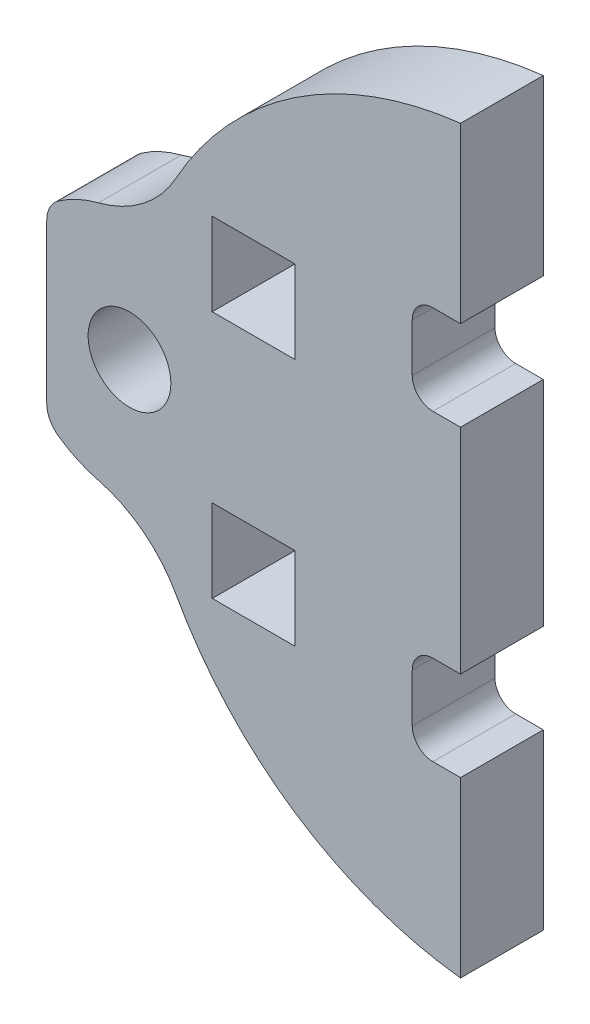
ISO-10303-21;
HEADER;
FILE_DESCRIPTION(('STEP AP214'),'2;1');
FILE_NAME('part.step','',(''),(''),'','','');
FILE_SCHEMA(('AUTOMOTIVE_DESIGN { 1 0 10303 214 1 1 1 1 }'));
ENDSEC;
DATA;
#1=APPLICATION_CONTEXT('core data for automotive mechanical design processes');
#2=APPLICATION_PROTOCOL_DEFINITION('international standard','automotive_design',2000,#1);
#3=PRODUCT_CONTEXT('',#1,'mechanical');
#4=PRODUCT('Part','Part','',(#3));
#5=PRODUCT_RELATED_PRODUCT_CATEGORY('part','',(#4));
#6=PRODUCT_DEFINITION_FORMATION('','',#4);
#7=PRODUCT_DEFINITION_CONTEXT('part definition',#1,'design');
#8=PRODUCT_DEFINITION('design','',#6,#7);
#9=PRODUCT_DEFINITION_SHAPE('','',#8);
#10=(LENGTH_UNIT() NAMED_UNIT(*) SI_UNIT(.MILLI.,.METRE.));
#11=(NAMED_UNIT(*) PLANE_ANGLE_UNIT() SI_UNIT($,.RADIAN.));
#12=(NAMED_UNIT(*) SI_UNIT($,.STERADIAN.) SOLID_ANGLE_UNIT());
#13=UNCERTAINTY_MEASURE_WITH_UNIT(LENGTH_MEASURE(1.E-05),#10,'distance_accuracy_value','');
#14=(GEOMETRIC_REPRESENTATION_CONTEXT(3) GLOBAL_UNCERTAINTY_ASSIGNED_CONTEXT((#13)) GLOBAL_UNIT_ASSIGNED_CONTEXT((#10,
#11,#12)) REPRESENTATION_CONTEXT('',''));
#15=CARTESIAN_POINT('',(0.,0.,0.));
#16=DIRECTION('',(0.,0.,1.));
#17=DIRECTION('',(1.,0.,0.));
#18=AXIS2_PLACEMENT_3D('',#15,#16,#17);
#19=CARTESIAN_POINT('',(14.6680433027,283.7018331993,3.));
#20=DIRECTION('',(0.,0.,1.));
#21=DIRECTION('',(1.,0.,0.));
#22=AXIS2_PLACEMENT_3D('',#19,#20,#21);
#23=PLANE('',#22);
#24=DIRECTION('',(1.,0.,0.));
#25=VECTOR('',#24,1.);
#26=CARTESIAN_POINT('',(17.6680433027,286.7018331993,3.));
#27=LINE('',#26,#25);
#28=CARTESIAN_POINT('',(17.6680433027,286.7018331993,3.));
#29=VERTEX_POINT('',#28);
#30=CARTESIAN_POINT('',(20.6680433027,286.7018331993,3.));
#31=VERTEX_POINT('',#30);
#32=EDGE_CURVE('E268',#29,#31,#27,.T.);
#33=ORIENTED_EDGE('',*,*,#32,.F.);
#34=DIRECTION('',(0.,-1.,0.));
#35=VECTOR('',#34,1.);
#36=CARTESIAN_POINT('',(17.6680433027,289.7018331993,3.));
#37=LINE('',#36,#35);
#38=CARTESIAN_POINT('',(17.6680433027,289.7018331993,3.));
#39=VERTEX_POINT('',#38);
#40=EDGE_CURVE('E266',#39,#29,#37,.T.);
#41=ORIENTED_EDGE('',*,*,#40,.F.);
#42=DIRECTION('',(-1.,0.,0.));
#43=VECTOR('',#42,1.);
#44=CARTESIAN_POINT('',(20.6680433027,289.7018331993,3.));
#45=LINE('',#44,#43);
#46=CARTESIAN_POINT('',(20.6680433027,289.7018331993,3.));
#47=VERTEX_POINT('',#46);
#48=EDGE_CURVE('E274',#47,#39,#45,.T.);
#49=ORIENTED_EDGE('',*,*,#48,.F.);
#50=DIRECTION('',(0.,1.,0.));
#51=VECTOR('',#50,1.);
#52=CARTESIAN_POINT('',(20.6680433027,286.7018331993,3.));
#53=LINE('',#52,#51);
#54=EDGE_CURVE('E271',#31,#47,#53,.T.);
#55=ORIENTED_EDGE('',*,*,#54,.F.);
#56=EDGE_LOOP('',(#33,#41,#49,#55));
#57=FACE_BOUND('',#56,.T.);
#58=CARTESIAN_POINT('',(14.6680433027,283.7018331993,3.));
#59=DIRECTION('',(0.,0.,1.));
#60=DIRECTION('',(1.,0.,0.));
#61=AXIS2_PLACEMENT_3D('',#58,#59,#60);
#62=CIRCLE('',#61,4.49999999999999);
#63=CARTESIAN_POINT('',(13.5430433027023,288.058939463784,3.));
#64=VERTEX_POINT('',#63);
#65=CARTESIAN_POINT('',(12.0966147312744,287.394766329219,3.));
#66=VERTEX_POINT('',#65);
#67=EDGE_CURVE('E303',#64,#66,#62,.T.);
#68=ORIENTED_EDGE('',*,*,#67,.T.);
#69=CARTESIAN_POINT('',(12.6680433027,286.574114522569,3.));
#70=DIRECTION('',(0.,0.,1.));
#71=DIRECTION('',(1.,0.,0.));
#72=AXIS2_PLACEMENT_3D('',#69,#70,#71);
#73=CIRCLE('',#72,0.999999999999989);
#74=CARTESIAN_POINT('',(11.6680433027,286.5741145225,3.));
#75=VERTEX_POINT('',#74);
#76=EDGE_CURVE('E306',#66,#75,#73,.T.);
#77=ORIENTED_EDGE('',*,*,#76,.T.);
#78=DIRECTION('',(0.,-1.,0.));
#79=VECTOR('',#78,1.);
#80=CARTESIAN_POINT('',(11.6680433027,286.5741145225,3.));
#81=LINE('',#80,#79);
#82=CARTESIAN_POINT('',(11.6680433027,280.829551876,3.));
#83=VERTEX_POINT('',#82);
#84=EDGE_CURVE('E309',#75,#83,#81,.T.);
#85=ORIENTED_EDGE('',*,*,#84,.T.);
#86=CARTESIAN_POINT('',(12.6680433027,280.829551876031,3.));
#87=DIRECTION('',(0.,0.,1.));
#88=DIRECTION('',(1.,0.,0.));
#89=AXIS2_PLACEMENT_3D('',#86,#87,#88);
#90=CIRCLE('',#89,0.999999999999995);
#91=CARTESIAN_POINT('',(12.0966147312744,280.008900069381,3.));
#92=VERTEX_POINT('',#91);
#93=EDGE_CURVE('E311',#83,#92,#90,.T.);
#94=ORIENTED_EDGE('',*,*,#93,.T.);
#95=CARTESIAN_POINT('',(14.6680433027,283.7018331993,3.));
#96=DIRECTION('',(0.,0.,1.));
#97=DIRECTION('',(1.,0.,0.));
#98=AXIS2_PLACEMENT_3D('',#95,#96,#97);
#99=CIRCLE('',#98,4.49999999999999);
#100=CARTESIAN_POINT('',(13.5430433027023,279.344726934816,3.));
#101=VERTEX_POINT('',#100);
#102=EDGE_CURVE('E313',#92,#101,#99,.T.);
#103=ORIENTED_EDGE('',*,*,#102,.T.);
#104=CARTESIAN_POINT('',(12.4180433027,274.987620670333,3.));
#105=DIRECTION('',(0.,0.,-1.));
#106=DIRECTION('',(1.,0.,0.));
#107=AXIS2_PLACEMENT_3D('',#104,#105,#106);
#108=CIRCLE('',#107,4.5);
#109=CARTESIAN_POINT('',(16.3555433027046,277.166173802567,3.));
#110=VERTEX_POINT('',#109);
#111=EDGE_CURVE('E315',#101,#110,#108,.T.);
#112=ORIENTED_EDGE('',*,*,#111,.T.);
#113=CARTESIAN_POINT('',(28.1680433027007,283.701833199299,3.));
#114=DIRECTION('',(0.,0.,1.));
#115=DIRECTION('',(1.,0.,0.));
#116=AXIS2_PLACEMENT_3D('',#113,#114,#115);
#117=CIRCLE('',#116,13.5);
#118=CARTESIAN_POINT('',(26.6680433027,270.2854253343,3.));
#119=VERTEX_POINT('',#118);
#120=EDGE_CURVE('E317',#110,#119,#117,.T.);
#121=ORIENTED_EDGE('',*,*,#120,.T.);
#122=DIRECTION('',(0.,1.,0.));
#123=VECTOR('',#122,1.);
#124=CARTESIAN_POINT('',(26.6680433027,276.5768331993,3.));
#125=LINE('',#124,#123);
#126=CARTESIAN_POINT('',(26.6680433027,276.5768331993,3.));
#127=VERTEX_POINT('',#126);
#128=EDGE_CURVE('E319',#119,#127,#125,.T.);
#129=ORIENTED_EDGE('',*,*,#128,.T.);
#130=DIRECTION('',(-1.,0.,0.));
#131=VECTOR('',#130,1.);
#132=CARTESIAN_POINT('',(25.6680433027,276.5768331993,3.));
#133=LINE('',#132,#131);
#134=CARTESIAN_POINT('',(25.6680433027,276.5768331993,3.));
#135=VERTEX_POINT('',#134);
#136=EDGE_CURVE('E321',#127,#135,#133,.T.);
#137=ORIENTED_EDGE('',*,*,#136,.T.);
#138=CARTESIAN_POINT('',(25.6680433027,277.3268331993,3.));
#139=DIRECTION('',(0.,0.,-1.));
#140=DIRECTION('',(1.,0.,0.));
#141=AXIS2_PLACEMENT_3D('',#138,#139,#140);
#142=CIRCLE('',#141,0.750000000000013);
#143=CARTESIAN_POINT('',(24.9180433027,277.3268331993,3.));
#144=VERTEX_POINT('',#143);
#145=EDGE_CURVE('E323',#135,#144,#142,.T.);
#146=ORIENTED_EDGE('',*,*,#145,.T.);
#147=DIRECTION('',(0.,1.,0.));
#148=VECTOR('',#147,1.);
#149=CARTESIAN_POINT('',(24.9180433027,279.0768331993,3.));
#150=LINE('',#149,#148);
#151=CARTESIAN_POINT('',(24.9180433027,279.0768331993,3.));
#152=VERTEX_POINT('',#151);
#153=EDGE_CURVE('E325',#144,#152,#150,.T.);
#154=ORIENTED_EDGE('',*,*,#153,.T.);
#155=CARTESIAN_POINT('',(25.6680433027,279.0768331993,3.));
#156=DIRECTION('',(0.,0.,-1.));
#157=DIRECTION('',(1.,0.,0.));
#158=AXIS2_PLACEMENT_3D('',#155,#156,#157);
#159=CIRCLE('',#158,0.749999999999985);
#160=CARTESIAN_POINT('',(25.6680433027,279.8268331993,3.));
#161=VERTEX_POINT('',#160);
#162=EDGE_CURVE('E327',#152,#161,#159,.T.);
#163=ORIENTED_EDGE('',*,*,#162,.T.);
#164=DIRECTION('',(1.,0.,0.));
#165=VECTOR('',#164,1.);
#166=CARTESIAN_POINT('',(26.6680433027,279.8268331993,3.));
#167=LINE('',#166,#165);
#168=CARTESIAN_POINT('',(26.6680433027,279.8268331993,3.));
#169=VERTEX_POINT('',#168);
#170=EDGE_CURVE('E329',#161,#169,#167,.T.);
#171=ORIENTED_EDGE('',*,*,#170,.T.);
#172=DIRECTION('',(0.,1.,0.));
#173=VECTOR('',#172,1.);
#174=CARTESIAN_POINT('',(26.6680433027,287.5768331993,3.));
#175=LINE('',#174,#173);
#176=CARTESIAN_POINT('',(26.6680433027,287.5768331993,3.));
#177=VERTEX_POINT('',#176);
#178=EDGE_CURVE('E331',#169,#177,#175,.T.);
#179=ORIENTED_EDGE('',*,*,#178,.T.);
#180=DIRECTION('',(-1.,0.,0.));
#181=VECTOR('',#180,1.);
#182=CARTESIAN_POINT('',(26.6680433027,287.5768331993,3.));
#183=LINE('',#182,#181);
#184=CARTESIAN_POINT('',(25.6680433027,287.5768331993,3.));
#185=VERTEX_POINT('',#184);
#186=EDGE_CURVE('E333',#177,#185,#183,.T.);
#187=ORIENTED_EDGE('',*,*,#186,.T.);
#188=CARTESIAN_POINT('',(25.6680433027,288.3268331993,3.));
#189=DIRECTION('',(0.,0.,-1.));
#190=DIRECTION('',(1.,0.,0.));
#191=AXIS2_PLACEMENT_3D('',#188,#189,#190);
#192=CIRCLE('',#191,0.749999999999985);
#193=CARTESIAN_POINT('',(24.9180433027,288.3268331993,3.));
#194=VERTEX_POINT('',#193);
#195=EDGE_CURVE('E335',#185,#194,#192,.T.);
#196=ORIENTED_EDGE('',*,*,#195,.T.);
#197=DIRECTION('',(0.,1.,0.));
#198=VECTOR('',#197,1.);
#199=CARTESIAN_POINT('',(24.9180433027,288.3268331993,3.));
#200=LINE('',#199,#198);
#201=CARTESIAN_POINT('',(24.9180433027,290.0768331993,3.));
#202=VERTEX_POINT('',#201);
#203=EDGE_CURVE('E337',#194,#202,#200,.T.);
#204=ORIENTED_EDGE('',*,*,#203,.T.);
#205=CARTESIAN_POINT('',(25.6680433027002,290.0768331993,3.));
#206=DIRECTION('',(0.,0.,-1.));
#207=DIRECTION('',(1.,0.,0.));
#208=AXIS2_PLACEMENT_3D('',#205,#206,#207);
#209=CIRCLE('',#208,0.750000000000193);
#210=CARTESIAN_POINT('',(25.6680433027,290.8268331993,3.));
#211=VERTEX_POINT('',#210);
#212=EDGE_CURVE('E339',#202,#211,#209,.T.);
#213=ORIENTED_EDGE('',*,*,#212,.T.);
#214=DIRECTION('',(1.,0.,0.));
#215=VECTOR('',#214,1.);
#216=CARTESIAN_POINT('',(25.6680433027,290.8268331993,3.));
#217=LINE('',#216,#215);
#218=CARTESIAN_POINT('',(26.6680433027,290.8268331993,3.));
#219=VERTEX_POINT('',#218);
#220=EDGE_CURVE('E341',#211,#219,#217,.T.);
#221=ORIENTED_EDGE('',*,*,#220,.T.);
#222=DIRECTION('',(0.,1.,0.));
#223=VECTOR('',#222,1.);
#224=CARTESIAN_POINT('',(26.6680433027,297.1182410643,3.));
#225=LINE('',#224,#223);
#226=CARTESIAN_POINT('',(26.6680433027,297.1182410643,3.));
#227=VERTEX_POINT('',#226);
#228=EDGE_CURVE('E343',#219,#227,#225,.T.);
#229=ORIENTED_EDGE('',*,*,#228,.T.);
#230=CARTESIAN_POINT('',(28.1680433027007,283.701833199299,3.));
#231=DIRECTION('',(0.,0.,1.));
#232=DIRECTION('',(1.,0.,0.));
#233=AXIS2_PLACEMENT_3D('',#230,#231,#232);
#234=CIRCLE('',#233,13.500000000002);
#235=CARTESIAN_POINT('',(16.355543302704,290.237492596034,3.));
#236=VERTEX_POINT('',#235);
#237=EDGE_CURVE('E345',#227,#236,#234,.T.);
#238=ORIENTED_EDGE('',*,*,#237,.T.);
#239=CARTESIAN_POINT('',(12.4180433027,292.416045728267,3.));
#240=DIRECTION('',(0.,0.,-1.));
#241=DIRECTION('',(1.,0.,0.));
#242=AXIS2_PLACEMENT_3D('',#239,#240,#241);
#243=CIRCLE('',#242,4.49999999999991);
#244=EDGE_CURVE('E347',#236,#64,#243,.T.);
#245=ORIENTED_EDGE('',*,*,#244,.T.);
#246=EDGE_LOOP('',(#68,#77,#85,#94,#103,#112,#121,#129,#137,#146,#154,#163,#171,#179,#187,#196,
#204,#213,#221,#229,#238,#245));
#247=FACE_BOUND('',#246,.T.);
#248=CARTESIAN_POINT('',(14.6680433027,283.7018331993,3.));
#249=DIRECTION('',(0.,0.,1.));
#250=DIRECTION('',(1.,0.,0.));
#251=AXIS2_PLACEMENT_3D('',#248,#249,#250);
#252=CIRCLE('',#251,1.5);
#253=CARTESIAN_POINT('',(16.1680433027,283.7018331993,3.));
#254=VERTEX_POINT('',#253);
#255=EDGE_CURVE('E297',#254,#254,#252,.T.);
#256=ORIENTED_EDGE('',*,*,#255,.F.);
#257=EDGE_LOOP('',(#256));
#258=FACE_BOUND('',#257,.T.);
#259=DIRECTION('',(1.,0.,0.));
#260=VECTOR('',#259,1.);
#261=CARTESIAN_POINT('',(17.6680433027,277.7018331993,3.));
#262=LINE('',#261,#260);
#263=CARTESIAN_POINT('',(17.6680433027,277.7018331993,3.));
#264=VERTEX_POINT('',#263);
#265=CARTESIAN_POINT('',(20.6680433027,277.7018331993,3.));
#266=VERTEX_POINT('',#265);
#267=EDGE_CURVE('E238',#264,#266,#262,.T.);
#268=ORIENTED_EDGE('',*,*,#267,.F.);
#269=DIRECTION('',(0.,-1.,0.));
#270=VECTOR('',#269,1.);
#271=CARTESIAN_POINT('',(17.6680433027,280.7018331993,3.));
#272=LINE('',#271,#270);
#273=CARTESIAN_POINT('',(17.6680433027,280.7018331993,3.));
#274=VERTEX_POINT('',#273);
#275=EDGE_CURVE('E230',#274,#264,#272,.T.);
#276=ORIENTED_EDGE('',*,*,#275,.F.);
#277=DIRECTION('',(-1.,0.,0.));
#278=VECTOR('',#277,1.);
#279=CARTESIAN_POINT('',(20.6680433027,280.7018331993,3.));
#280=LINE('',#279,#278);
#281=CARTESIAN_POINT('',(20.6680433027,280.7018331993,3.));
#282=VERTEX_POINT('',#281);
#283=EDGE_CURVE('E252',#282,#274,#280,.T.);
#284=ORIENTED_EDGE('',*,*,#283,.F.);
#285=DIRECTION('',(0.,1.,0.));
#286=VECTOR('',#285,1.);
#287=CARTESIAN_POINT('',(20.6680433027,277.7018331993,3.));
#288=LINE('',#287,#286);
#289=EDGE_CURVE('E250',#266,#282,#288,.T.);
#290=ORIENTED_EDGE('',*,*,#289,.F.);
#291=EDGE_LOOP('',(#268,#276,#284,#290));
#292=FACE_BOUND('',#291,.T.);
#293=ADVANCED_FACE('F33',(#57,#247,#258,#292),#23,.T.);
#294=CARTESIAN_POINT('',(14.6680433027,283.7018331993,0.));
#295=DIRECTION('',(0.,0.,1.));
#296=DIRECTION('',(1.,0.,0.));
#297=AXIS2_PLACEMENT_3D('',#294,#295,#296);
#298=PLANE('',#297);
#299=DIRECTION('',(0.,-1.,0.));
#300=VECTOR('',#299,1.);
#301=CARTESIAN_POINT('',(17.6680433027,289.7018331993,0.));
#302=LINE('',#301,#300);
#303=CARTESIAN_POINT('',(17.6680433027,289.7018331993,0.));
#304=VERTEX_POINT('',#303);
#305=CARTESIAN_POINT('',(17.6680433027,286.7018331993,0.));
#306=VERTEX_POINT('',#305);
#307=EDGE_CURVE('E246',#304,#306,#302,.T.);
#308=ORIENTED_EDGE('',*,*,#307,.T.);
#309=DIRECTION('',(1.,0.,0.));
#310=VECTOR('',#309,1.);
#311=CARTESIAN_POINT('',(17.6680433027,286.7018331993,0.));
#312=LINE('',#311,#310);
#313=CARTESIAN_POINT('',(20.6680433027,286.7018331993,0.));
#314=VERTEX_POINT('',#313);
#315=EDGE_CURVE('E279',#306,#314,#312,.T.);
#316=ORIENTED_EDGE('',*,*,#315,.T.);
#317=DIRECTION('',(0.,1.,0.));
#318=VECTOR('',#317,1.);
#319=CARTESIAN_POINT('',(20.6680433027,286.7018331993,0.));
#320=LINE('',#319,#318);
#321=CARTESIAN_POINT('',(20.6680433027,289.7018331993,0.));
#322=VERTEX_POINT('',#321);
#323=EDGE_CURVE('E282',#314,#322,#320,.T.);
#324=ORIENTED_EDGE('',*,*,#323,.T.);
#325=DIRECTION('',(-1.,0.,0.));
#326=VECTOR('',#325,1.);
#327=CARTESIAN_POINT('',(20.6680433027,289.7018331993,0.));
#328=LINE('',#327,#326);
#329=EDGE_CURVE('E269',#322,#304,#328,.T.);
#330=ORIENTED_EDGE('',*,*,#329,.T.);
#331=EDGE_LOOP('',(#308,#316,#324,#330));
#332=FACE_BOUND('',#331,.T.);
#333=CARTESIAN_POINT('',(14.6680433027,283.7018331993,0.));
#334=DIRECTION('',(0.,0.,1.));
#335=DIRECTION('',(1.,0.,0.));
#336=AXIS2_PLACEMENT_3D('',#333,#334,#335);
#337=CIRCLE('',#336,4.49999999999999);
#338=CARTESIAN_POINT('',(13.5430433027023,288.058939463784,0.));
#339=VERTEX_POINT('',#338);
#340=CARTESIAN_POINT('',(12.0966147312744,287.394766329219,0.));
#341=VERTEX_POINT('',#340);
#342=EDGE_CURVE('E300',#339,#341,#337,.T.);
#343=ORIENTED_EDGE('',*,*,#342,.F.);
#344=CARTESIAN_POINT('',(12.4180433027,292.416045728267,0.));
#345=DIRECTION('',(0.,0.,-1.));
#346=DIRECTION('',(1.,0.,0.));
#347=AXIS2_PLACEMENT_3D('',#344,#345,#346);
#348=CIRCLE('',#347,4.49999999999991);
#349=CARTESIAN_POINT('',(16.355543302704,290.237492596034,0.));
#350=VERTEX_POINT('',#349);
#351=EDGE_CURVE('E307',#350,#339,#348,.T.);
#352=ORIENTED_EDGE('',*,*,#351,.F.);
#353=CARTESIAN_POINT('',(28.1680433027007,283.701833199299,0.));
#354=DIRECTION('',(0.,0.,1.));
#355=DIRECTION('',(1.,0.,0.));
#356=AXIS2_PLACEMENT_3D('',#353,#354,#355);
#357=CIRCLE('',#356,13.500000000002);
#358=CARTESIAN_POINT('',(26.6680433027,297.1182410643,0.));
#359=VERTEX_POINT('',#358);
#360=EDGE_CURVE('E390',#359,#350,#357,.T.);
#361=ORIENTED_EDGE('',*,*,#360,.F.);
#362=DIRECTION('',(0.,1.,0.));
#363=VECTOR('',#362,1.);
#364=CARTESIAN_POINT('',(26.6680433027,297.1182410643,0.));
#365=LINE('',#364,#363);
#366=CARTESIAN_POINT('',(26.6680433027,290.8268331993,0.));
#367=VERTEX_POINT('',#366);
#368=EDGE_CURVE('E388',#367,#359,#365,.T.);
#369=ORIENTED_EDGE('',*,*,#368,.F.);
#370=DIRECTION('',(1.,0.,0.));
#371=VECTOR('',#370,1.);
#372=CARTESIAN_POINT('',(25.6680433027,290.8268331993,0.));
#373=LINE('',#372,#371);
#374=CARTESIAN_POINT('',(25.6680433027,290.8268331993,0.));
#375=VERTEX_POINT('',#374);
#376=EDGE_CURVE('E386',#375,#367,#373,.T.);
#377=ORIENTED_EDGE('',*,*,#376,.F.);
#378=CARTESIAN_POINT('',(25.6680433027002,290.0768331993,0.));
#379=DIRECTION('',(0.,0.,-1.));
#380=DIRECTION('',(1.,0.,0.));
#381=AXIS2_PLACEMENT_3D('',#378,#379,#380);
#382=CIRCLE('',#381,0.750000000000193);
#383=CARTESIAN_POINT('',(24.9180433027,290.0768331993,0.));
#384=VERTEX_POINT('',#383);
#385=EDGE_CURVE('E384',#384,#375,#382,.T.);
#386=ORIENTED_EDGE('',*,*,#385,.F.);
#387=DIRECTION('',(0.,1.,0.));
#388=VECTOR('',#387,1.);
#389=CARTESIAN_POINT('',(24.9180433027,288.3268331993,0.));
#390=LINE('',#389,#388);
#391=CARTESIAN_POINT('',(24.9180433027,288.3268331993,0.));
#392=VERTEX_POINT('',#391);
#393=EDGE_CURVE('E382',#392,#384,#390,.T.);
#394=ORIENTED_EDGE('',*,*,#393,.F.);
#395=CARTESIAN_POINT('',(25.6680433027,288.3268331993,0.));
#396=DIRECTION('',(0.,0.,-1.));
#397=DIRECTION('',(1.,0.,0.));
#398=AXIS2_PLACEMENT_3D('',#395,#396,#397);
#399=CIRCLE('',#398,0.749999999999985);
#400=CARTESIAN_POINT('',(25.6680433027,287.5768331993,0.));
#401=VERTEX_POINT('',#400);
#402=EDGE_CURVE('E380',#401,#392,#399,.T.);
#403=ORIENTED_EDGE('',*,*,#402,.F.);
#404=DIRECTION('',(-1.,0.,0.));
#405=VECTOR('',#404,1.);
#406=CARTESIAN_POINT('',(26.6680433027,287.5768331993,0.));
#407=LINE('',#406,#405);
#408=CARTESIAN_POINT('',(26.6680433027,287.5768331993,0.));
#409=VERTEX_POINT('',#408);
#410=EDGE_CURVE('E378',#409,#401,#407,.T.);
#411=ORIENTED_EDGE('',*,*,#410,.F.);
#412=DIRECTION('',(0.,1.,0.));
#413=VECTOR('',#412,1.);
#414=CARTESIAN_POINT('',(26.6680433027,287.5768331993,0.));
#415=LINE('',#414,#413);
#416=CARTESIAN_POINT('',(26.6680433027,279.8268331993,0.));
#417=VERTEX_POINT('',#416);
#418=EDGE_CURVE('E376',#417,#409,#415,.T.);
#419=ORIENTED_EDGE('',*,*,#418,.F.);
#420=DIRECTION('',(1.,0.,0.));
#421=VECTOR('',#420,1.);
#422=CARTESIAN_POINT('',(26.6680433027,279.8268331993,0.));
#423=LINE('',#422,#421);
#424=CARTESIAN_POINT('',(25.6680433027,279.8268331993,0.));
#425=VERTEX_POINT('',#424);
#426=EDGE_CURVE('E374',#425,#417,#423,.T.);
#427=ORIENTED_EDGE('',*,*,#426,.F.);
#428=CARTESIAN_POINT('',(25.6680433027,279.0768331993,0.));
#429=DIRECTION('',(0.,0.,-1.));
#430=DIRECTION('',(1.,0.,0.));
#431=AXIS2_PLACEMENT_3D('',#428,#429,#430);
#432=CIRCLE('',#431,0.749999999999985);
#433=CARTESIAN_POINT('',(24.9180433027,279.0768331993,0.));
#434=VERTEX_POINT('',#433);
#435=EDGE_CURVE('E372',#434,#425,#432,.T.);
#436=ORIENTED_EDGE('',*,*,#435,.F.);
#437=DIRECTION('',(0.,1.,0.));
#438=VECTOR('',#437,1.);
#439=CARTESIAN_POINT('',(24.9180433027,279.0768331993,0.));
#440=LINE('',#439,#438);
#441=CARTESIAN_POINT('',(24.9180433027,277.3268331993,0.));
#442=VERTEX_POINT('',#441);
#443=EDGE_CURVE('E370',#442,#434,#440,.T.);
#444=ORIENTED_EDGE('',*,*,#443,.F.);
#445=CARTESIAN_POINT('',(25.6680433027,277.3268331993,0.));
#446=DIRECTION('',(0.,0.,-1.));
#447=DIRECTION('',(1.,0.,0.));
#448=AXIS2_PLACEMENT_3D('',#445,#446,#447);
#449=CIRCLE('',#448,0.750000000000013);
#450=CARTESIAN_POINT('',(25.6680433027,276.5768331993,0.));
#451=VERTEX_POINT('',#450);
#452=EDGE_CURVE('E368',#451,#442,#449,.T.);
#453=ORIENTED_EDGE('',*,*,#452,.F.);
#454=DIRECTION('',(-1.,0.,0.));
#455=VECTOR('',#454,1.);
#456=CARTESIAN_POINT('',(25.6680433027,276.5768331993,0.));
#457=LINE('',#456,#455);
#458=CARTESIAN_POINT('',(26.6680433027,276.5768331993,0.));
#459=VERTEX_POINT('',#458);
#460=EDGE_CURVE('E366',#459,#451,#457,.T.);
#461=ORIENTED_EDGE('',*,*,#460,.F.);
#462=DIRECTION('',(0.,1.,0.));
#463=VECTOR('',#462,1.);
#464=CARTESIAN_POINT('',(26.6680433027,276.5768331993,0.));
#465=LINE('',#464,#463);
#466=CARTESIAN_POINT('',(26.6680433027,270.2854253343,0.));
#467=VERTEX_POINT('',#466);
#468=EDGE_CURVE('E364',#467,#459,#465,.T.);
#469=ORIENTED_EDGE('',*,*,#468,.F.);
#470=CARTESIAN_POINT('',(28.1680433027007,283.701833199299,0.));
#471=DIRECTION('',(0.,0.,1.));
#472=DIRECTION('',(1.,0.,0.));
#473=AXIS2_PLACEMENT_3D('',#470,#471,#472);
#474=CIRCLE('',#473,13.5);
#475=CARTESIAN_POINT('',(16.3555433027046,277.166173802567,0.));
#476=VERTEX_POINT('',#475);
#477=EDGE_CURVE('E362',#476,#467,#474,.T.);
#478=ORIENTED_EDGE('',*,*,#477,.F.);
#479=CARTESIAN_POINT('',(12.4180433027,274.987620670333,0.));
#480=DIRECTION('',(0.,0.,-1.));
#481=DIRECTION('',(1.,0.,0.));
#482=AXIS2_PLACEMENT_3D('',#479,#480,#481);
#483=CIRCLE('',#482,4.5);
#484=CARTESIAN_POINT('',(13.5430433027023,279.344726934816,0.));
#485=VERTEX_POINT('',#484);
#486=EDGE_CURVE('E360',#485,#476,#483,.T.);
#487=ORIENTED_EDGE('',*,*,#486,.F.);
#488=CARTESIAN_POINT('',(14.6680433027,283.7018331993,0.));
#489=DIRECTION('',(0.,0.,1.));
#490=DIRECTION('',(1.,0.,0.));
#491=AXIS2_PLACEMENT_3D('',#488,#489,#490);
#492=CIRCLE('',#491,4.49999999999999);
#493=CARTESIAN_POINT('',(12.0966147312744,280.008900069381,0.));
#494=VERTEX_POINT('',#493);
#495=EDGE_CURVE('E358',#494,#485,#492,.T.);
#496=ORIENTED_EDGE('',*,*,#495,.F.);
#497=CARTESIAN_POINT('',(12.6680433027,280.829551876031,0.));
#498=DIRECTION('',(0.,0.,1.));
#499=DIRECTION('',(1.,0.,0.));
#500=AXIS2_PLACEMENT_3D('',#497,#498,#499);
#501=CIRCLE('',#500,0.999999999999995);
#502=CARTESIAN_POINT('',(11.6680433027,280.829551876,0.));
#503=VERTEX_POINT('',#502);
#504=EDGE_CURVE('E356',#503,#494,#501,.T.);
#505=ORIENTED_EDGE('',*,*,#504,.F.);
#506=DIRECTION('',(0.,-1.,0.));
#507=VECTOR('',#506,1.);
#508=CARTESIAN_POINT('',(11.6680433027,286.5741145225,0.));
#509=LINE('',#508,#507);
#510=CARTESIAN_POINT('',(11.6680433027,286.5741145225,0.));
#511=VERTEX_POINT('',#510);
#512=EDGE_CURVE('E354',#511,#503,#509,.T.);
#513=ORIENTED_EDGE('',*,*,#512,.F.);
#514=CARTESIAN_POINT('',(12.6680433027,286.574114522569,0.));
#515=DIRECTION('',(0.,0.,1.));
#516=DIRECTION('',(1.,0.,0.));
#517=AXIS2_PLACEMENT_3D('',#514,#515,#516);
#518=CIRCLE('',#517,0.999999999999989);
#519=EDGE_CURVE('E352',#341,#511,#518,.T.);
#520=ORIENTED_EDGE('',*,*,#519,.F.);
#521=EDGE_LOOP('',(#343,#352,#361,#369,#377,#386,#394,#403,#411,#419,#427,#436,#444,#453,#461,
#469,#478,#487,#496,#505,#513,#520));
#522=FACE_BOUND('',#521,.T.);
#523=CARTESIAN_POINT('',(14.6680433027,283.7018331993,0.));
#524=DIRECTION('',(0.,0.,1.));
#525=DIRECTION('',(1.,0.,0.));
#526=AXIS2_PLACEMENT_3D('',#523,#524,#525);
#527=CIRCLE('',#526,1.5);
#528=CARTESIAN_POINT('',(16.1680433027,283.7018331993,0.));
#529=VERTEX_POINT('',#528);
#530=EDGE_CURVE('E296',#529,#529,#527,.T.);
#531=ORIENTED_EDGE('',*,*,#530,.T.);
#532=EDGE_LOOP('',(#531));
#533=FACE_BOUND('',#532,.T.);
#534=DIRECTION('',(0.,-1.,0.));
#535=VECTOR('',#534,1.);
#536=CARTESIAN_POINT('',(17.6680433027,280.7018331993,0.));
#537=LINE('',#536,#535);
#538=CARTESIAN_POINT('',(17.6680433027,280.7018331993,0.));
#539=VERTEX_POINT('',#538);
#540=CARTESIAN_POINT('',(17.6680433027,277.7018331993,0.));
#541=VERTEX_POINT('',#540);
#542=EDGE_CURVE('E56',#539,#541,#537,.T.);
#543=ORIENTED_EDGE('',*,*,#542,.T.);
#544=DIRECTION('',(1.,0.,0.));
#545=VECTOR('',#544,1.);
#546=CARTESIAN_POINT('',(17.6680433027,277.7018331993,0.));
#547=LINE('',#546,#545);
#548=CARTESIAN_POINT('',(20.6680433027,277.7018331993,0.));
#549=VERTEX_POINT('',#548);
#550=EDGE_CURVE('E245',#541,#549,#547,.T.);
#551=ORIENTED_EDGE('',*,*,#550,.T.);
#552=DIRECTION('',(0.,1.,0.));
#553=VECTOR('',#552,1.);
#554=CARTESIAN_POINT('',(20.6680433027,277.7018331993,0.));
#555=LINE('',#554,#553);
#556=CARTESIAN_POINT('',(20.6680433027,280.7018331993,0.));
#557=VERTEX_POINT('',#556);
#558=EDGE_CURVE('E258',#549,#557,#555,.T.);
#559=ORIENTED_EDGE('',*,*,#558,.T.);
#560=DIRECTION('',(-1.,0.,0.));
#561=VECTOR('',#560,1.);
#562=CARTESIAN_POINT('',(20.6680433027,280.7018331993,0.));
#563=LINE('',#562,#561);
#564=EDGE_CURVE('E239',#557,#539,#563,.T.);
#565=ORIENTED_EDGE('',*,*,#564,.T.);
#566=EDGE_LOOP('',(#543,#551,#559,#565));
#567=FACE_BOUND('',#566,.T.);
#568=ADVANCED_FACE('F462',(#332,#522,#533,#567),#298,.F.);
#569=CARTESIAN_POINT('',(14.6680433027,283.7018331993,3.));
#570=DIRECTION('',(0.,0.,-1.));
#571=DIRECTION('',(-1.,0.,0.));
#572=AXIS2_PLACEMENT_3D('',#569,#570,#571);
#573=CYLINDRICAL_SURFACE('',#572,4.49999999999999);
#574=ORIENTED_EDGE('',*,*,#342,.T.);
#575=DIRECTION('',(0.,0.,-1.));
#576=VECTOR('',#575,1.);
#577=CARTESIAN_POINT('',(12.0966147312744,287.394766329219,3.));
#578=LINE('',#577,#576);
#579=EDGE_CURVE('E11',#66,#341,#578,.T.);
#580=ORIENTED_EDGE('',*,*,#579,.F.);
#581=ORIENTED_EDGE('',*,*,#67,.F.);
#582=DIRECTION('',(0.,0.,-1.));
#583=VECTOR('',#582,1.);
#584=CARTESIAN_POINT('',(13.5430433027023,288.058939463784,3.));
#585=LINE('',#584,#583);
#586=EDGE_CURVE('E349',#64,#339,#585,.T.);
#587=ORIENTED_EDGE('',*,*,#586,.T.);
#588=EDGE_LOOP('',(#574,#580,#581,#587));
#589=FACE_BOUND('',#588,.T.);
#590=ADVANCED_FACE('F35',(#589),#573,.T.);
#591=CARTESIAN_POINT('',(12.6680433027,286.574114522569,3.));
#592=DIRECTION('',(0.,0.,-1.));
#593=DIRECTION('',(-1.,0.,0.));
#594=AXIS2_PLACEMENT_3D('',#591,#592,#593);
#595=CYLINDRICAL_SURFACE('',#594,0.999999999999989);
#596=ORIENTED_EDGE('',*,*,#519,.T.);
#597=DIRECTION('',(0.,0.,-1.));
#598=VECTOR('',#597,1.);
#599=CARTESIAN_POINT('',(11.6680433027,286.5741145225,3.));
#600=LINE('',#599,#598);
#601=EDGE_CURVE('E41',#75,#511,#600,.T.);
#602=ORIENTED_EDGE('',*,*,#601,.F.);
#603=ORIENTED_EDGE('',*,*,#76,.F.);
#604=ORIENTED_EDGE('',*,*,#579,.T.);
#605=EDGE_LOOP('',(#596,#602,#603,#604));
#606=FACE_BOUND('',#605,.T.);
#607=ADVANCED_FACE('F480',(#606),#595,.T.);
#608=CARTESIAN_POINT('',(11.6680433027,286.5741145225,3.));
#609=DIRECTION('',(1.,0.,0.));
#610=DIRECTION('',(0.,0.,-1.));
#611=AXIS2_PLACEMENT_3D('',#608,#609,#610);
#612=PLANE('',#611);
#613=ORIENTED_EDGE('',*,*,#512,.T.);
#614=DIRECTION('',(0.,0.,-1.));
#615=VECTOR('',#614,1.);
#616=CARTESIAN_POINT('',(11.6680433027,280.829551876,3.));
#617=LINE('',#616,#615);
#618=EDGE_CURVE('E449',#83,#503,#617,.T.);
#619=ORIENTED_EDGE('',*,*,#618,.F.);
#620=ORIENTED_EDGE('',*,*,#84,.F.);
#621=ORIENTED_EDGE('',*,*,#601,.T.);
#622=EDGE_LOOP('',(#613,#619,#620,#621));
#623=FACE_BOUND('',#622,.T.);
#624=ADVANCED_FACE('F456',(#623),#612,.F.);
#625=CARTESIAN_POINT('',(12.6680433027,280.829551876031,3.));
#626=DIRECTION('',(0.,0.,-1.));
#627=DIRECTION('',(-1.,0.,0.));
#628=AXIS2_PLACEMENT_3D('',#625,#626,#627);
#629=CYLINDRICAL_SURFACE('',#628,0.999999999999995);
#630=ORIENTED_EDGE('',*,*,#504,.T.);
#631=DIRECTION('',(0.,0.,-1.));
#632=VECTOR('',#631,1.);
#633=CARTESIAN_POINT('',(12.0966147312744,280.008900069381,3.));
#634=LINE('',#633,#632);
#635=EDGE_CURVE('E446',#92,#494,#634,.T.);
#636=ORIENTED_EDGE('',*,*,#635,.F.);
#637=ORIENTED_EDGE('',*,*,#93,.F.);
#638=ORIENTED_EDGE('',*,*,#618,.T.);
#639=EDGE_LOOP('',(#630,#636,#637,#638));
#640=FACE_BOUND('',#639,.T.);
#641=ADVANCED_FACE('F468',(#640),#629,.T.);
#642=CARTESIAN_POINT('',(14.6680433027,283.7018331993,3.));
#643=DIRECTION('',(0.,0.,-1.));
#644=DIRECTION('',(-1.,0.,0.));
#645=AXIS2_PLACEMENT_3D('',#642,#643,#644);
#646=CYLINDRICAL_SURFACE('',#645,4.49999999999999);
#647=ORIENTED_EDGE('',*,*,#495,.T.);
#648=DIRECTION('',(0.,0.,-1.));
#649=VECTOR('',#648,1.);
#650=CARTESIAN_POINT('',(13.5430433027023,279.344726934816,3.));
#651=LINE('',#650,#649);
#652=EDGE_CURVE('E443',#101,#485,#651,.T.);
#653=ORIENTED_EDGE('',*,*,#652,.F.);
#654=ORIENTED_EDGE('',*,*,#102,.F.);
#655=ORIENTED_EDGE('',*,*,#635,.T.);
#656=EDGE_LOOP('',(#647,#653,#654,#655));
#657=FACE_BOUND('',#656,.T.);
#658=ADVANCED_FACE('F472',(#657),#646,.T.);
#659=CARTESIAN_POINT('',(12.4180433027,274.987620670333,3.));
#660=DIRECTION('',(0.,0.,-1.));
#661=DIRECTION('',(-1.,0.,0.));
#662=AXIS2_PLACEMENT_3D('',#659,#660,#661);
#663=CYLINDRICAL_SURFACE('',#662,4.5);
#664=ORIENTED_EDGE('',*,*,#486,.T.);
#665=DIRECTION('',(0.,0.,-1.));
#666=VECTOR('',#665,1.);
#667=CARTESIAN_POINT('',(16.3555433027046,277.166173802567,3.));
#668=LINE('',#667,#666);
#669=EDGE_CURVE('E440',#110,#476,#668,.T.);
#670=ORIENTED_EDGE('',*,*,#669,.F.);
#671=ORIENTED_EDGE('',*,*,#111,.F.);
#672=ORIENTED_EDGE('',*,*,#652,.T.);
#673=EDGE_LOOP('',(#664,#670,#671,#672));
#674=FACE_BOUND('',#673,.T.);
#675=ADVANCED_FACE('F563',(#674),#663,.F.);
#676=CARTESIAN_POINT('',(28.1680433027007,283.701833199299,3.));
#677=DIRECTION('',(0.,0.,-1.));
#678=DIRECTION('',(-1.,0.,0.));
#679=AXIS2_PLACEMENT_3D('',#676,#677,#678);
#680=CYLINDRICAL_SURFACE('',#679,13.5);
#681=ORIENTED_EDGE('',*,*,#477,.T.);
#682=DIRECTION('',(0.,0.,-1.));
#683=VECTOR('',#682,1.);
#684=CARTESIAN_POINT('',(26.6680433027,270.2854253343,3.));
#685=LINE('',#684,#683);
#686=EDGE_CURVE('E437',#119,#467,#685,.T.);
#687=ORIENTED_EDGE('',*,*,#686,.F.);
#688=ORIENTED_EDGE('',*,*,#120,.F.);
#689=ORIENTED_EDGE('',*,*,#669,.T.);
#690=EDGE_LOOP('',(#681,#687,#688,#689));
#691=FACE_BOUND('',#690,.T.);
#692=ADVANCED_FACE('F560',(#691),#680,.T.);
#693=CARTESIAN_POINT('',(26.6680433027,276.5768331993,3.));
#694=DIRECTION('',(-1.,0.,0.));
#695=DIRECTION('',(0.,0.,1.));
#696=AXIS2_PLACEMENT_3D('',#693,#694,#695);
#697=PLANE('',#696);
#698=ORIENTED_EDGE('',*,*,#468,.T.);
#699=DIRECTION('',(0.,0.,-1.));
#700=VECTOR('',#699,1.);
#701=CARTESIAN_POINT('',(26.6680433027,276.5768331993,3.));
#702=LINE('',#701,#700);
#703=EDGE_CURVE('E434',#127,#459,#702,.T.);
#704=ORIENTED_EDGE('',*,*,#703,.F.);
#705=ORIENTED_EDGE('',*,*,#128,.F.);
#706=ORIENTED_EDGE('',*,*,#686,.T.);
#707=EDGE_LOOP('',(#698,#704,#705,#706));
#708=FACE_BOUND('',#707,.T.);
#709=ADVANCED_FACE('F556',(#708),#697,.F.);
#710=CARTESIAN_POINT('',(25.6680433027,276.5768331993,3.));
#711=DIRECTION('',(0.,-1.,0.));
#712=DIRECTION('',(0.,0.,-1.));
#713=AXIS2_PLACEMENT_3D('',#710,#711,#712);
#714=PLANE('',#713);
#715=ORIENTED_EDGE('',*,*,#460,.T.);
#716=DIRECTION('',(0.,0.,-1.));
#717=VECTOR('',#716,1.);
#718=CARTESIAN_POINT('',(25.6680433027,276.5768331993,3.));
#719=LINE('',#718,#717);
#720=EDGE_CURVE('E431',#135,#451,#719,.T.);
#721=ORIENTED_EDGE('',*,*,#720,.F.);
#722=ORIENTED_EDGE('',*,*,#136,.F.);
#723=ORIENTED_EDGE('',*,*,#703,.T.);
#724=EDGE_LOOP('',(#715,#721,#722,#723));
#725=FACE_BOUND('',#724,.T.);
#726=ADVANCED_FACE('F552',(#725),#714,.F.);
#727=CARTESIAN_POINT('',(25.6680433027,277.3268331993,3.));
#728=DIRECTION('',(0.,0.,-1.));
#729=DIRECTION('',(-1.,0.,0.));
#730=AXIS2_PLACEMENT_3D('',#727,#728,#729);
#731=CYLINDRICAL_SURFACE('',#730,0.750000000000013);
#732=ORIENTED_EDGE('',*,*,#452,.T.);
#733=DIRECTION('',(0.,0.,-1.));
#734=VECTOR('',#733,1.);
#735=CARTESIAN_POINT('',(24.9180433027,277.3268331993,3.));
#736=LINE('',#735,#734);
#737=EDGE_CURVE('E428',#144,#442,#736,.T.);
#738=ORIENTED_EDGE('',*,*,#737,.F.);
#739=ORIENTED_EDGE('',*,*,#145,.F.);
#740=ORIENTED_EDGE('',*,*,#720,.T.);
#741=EDGE_LOOP('',(#732,#738,#739,#740));
#742=FACE_BOUND('',#741,.T.);
#743=ADVANCED_FACE('F547',(#742),#731,.F.);
#744=CARTESIAN_POINT('',(24.9180433027,279.0768331993,3.));
#745=DIRECTION('',(-1.,0.,0.));
#746=DIRECTION('',(0.,0.,1.));
#747=AXIS2_PLACEMENT_3D('',#744,#745,#746);
#748=PLANE('',#747);
#749=ORIENTED_EDGE('',*,*,#443,.T.);
#750=DIRECTION('',(0.,0.,-1.));
#751=VECTOR('',#750,1.);
#752=CARTESIAN_POINT('',(24.9180433027,279.0768331993,3.));
#753=LINE('',#752,#751);
#754=EDGE_CURVE('E425',#152,#434,#753,.T.);
#755=ORIENTED_EDGE('',*,*,#754,.F.);
#756=ORIENTED_EDGE('',*,*,#153,.F.);
#757=ORIENTED_EDGE('',*,*,#737,.T.);
#758=EDGE_LOOP('',(#749,#755,#756,#757));
#759=FACE_BOUND('',#758,.T.);
#760=ADVANCED_FACE('F541',(#759),#748,.F.);
#761=CARTESIAN_POINT('',(25.6680433027,279.0768331993,3.));
#762=DIRECTION('',(0.,0.,-1.));
#763=DIRECTION('',(-1.,0.,0.));
#764=AXIS2_PLACEMENT_3D('',#761,#762,#763);
#765=CYLINDRICAL_SURFACE('',#764,0.749999999999985);
#766=ORIENTED_EDGE('',*,*,#435,.T.);
#767=DIRECTION('',(0.,0.,-1.));
#768=VECTOR('',#767,1.);
#769=CARTESIAN_POINT('',(25.6680433027,279.8268331993,3.));
#770=LINE('',#769,#768);
#771=EDGE_CURVE('E422',#161,#425,#770,.T.);
#772=ORIENTED_EDGE('',*,*,#771,.F.);
#773=ORIENTED_EDGE('',*,*,#162,.F.);
#774=ORIENTED_EDGE('',*,*,#754,.T.);
#775=EDGE_LOOP('',(#766,#772,#773,#774));
#776=FACE_BOUND('',#775,.T.);
#777=ADVANCED_FACE('F537',(#776),#765,.F.);
#778=CARTESIAN_POINT('',(26.6680433027,279.8268331993,3.));
#779=DIRECTION('',(0.,1.,0.));
#780=DIRECTION('',(0.,0.,1.));
#781=AXIS2_PLACEMENT_3D('',#778,#779,#780);
#782=PLANE('',#781);
#783=ORIENTED_EDGE('',*,*,#426,.T.);
#784=DIRECTION('',(0.,0.,-1.));
#785=VECTOR('',#784,1.);
#786=CARTESIAN_POINT('',(26.6680433027,279.8268331993,3.));
#787=LINE('',#786,#785);
#788=EDGE_CURVE('E419',#169,#417,#787,.T.);
#789=ORIENTED_EDGE('',*,*,#788,.F.);
#790=ORIENTED_EDGE('',*,*,#170,.F.);
#791=ORIENTED_EDGE('',*,*,#771,.T.);
#792=EDGE_LOOP('',(#783,#789,#790,#791));
#793=FACE_BOUND('',#792,.T.);
#794=ADVANCED_FACE('F532',(#793),#782,.F.);
#795=CARTESIAN_POINT('',(26.6680433027,287.5768331993,3.));
#796=DIRECTION('',(-1.,0.,0.));
#797=DIRECTION('',(0.,0.,1.));
#798=AXIS2_PLACEMENT_3D('',#795,#796,#797);
#799=PLANE('',#798);
#800=ORIENTED_EDGE('',*,*,#418,.T.);
#801=DIRECTION('',(0.,0.,-1.));
#802=VECTOR('',#801,1.);
#803=CARTESIAN_POINT('',(26.6680433027,287.5768331993,3.));
#804=LINE('',#803,#802);
#805=EDGE_CURVE('E416',#177,#409,#804,.T.);
#806=ORIENTED_EDGE('',*,*,#805,.F.);
#807=ORIENTED_EDGE('',*,*,#178,.F.);
#808=ORIENTED_EDGE('',*,*,#788,.T.);
#809=EDGE_LOOP('',(#800,#806,#807,#808));
#810=FACE_BOUND('',#809,.T.);
#811=ADVANCED_FACE('F526',(#810),#799,.F.);
#812=CARTESIAN_POINT('',(26.6680433027,287.5768331993,3.));
#813=DIRECTION('',(0.,-1.,0.));
#814=DIRECTION('',(0.,0.,-1.));
#815=AXIS2_PLACEMENT_3D('',#812,#813,#814);
#816=PLANE('',#815);
#817=ORIENTED_EDGE('',*,*,#410,.T.);
#818=DIRECTION('',(0.,0.,-1.));
#819=VECTOR('',#818,1.);
#820=CARTESIAN_POINT('',(25.6680433027,287.5768331993,3.));
#821=LINE('',#820,#819);
#822=EDGE_CURVE('E413',#185,#401,#821,.T.);
#823=ORIENTED_EDGE('',*,*,#822,.F.);
#824=ORIENTED_EDGE('',*,*,#186,.F.);
#825=ORIENTED_EDGE('',*,*,#805,.T.);
#826=EDGE_LOOP('',(#817,#823,#824,#825));
#827=FACE_BOUND('',#826,.T.);
#828=ADVANCED_FACE('F522',(#827),#816,.F.);
#829=CARTESIAN_POINT('',(25.6680433027,288.3268331993,3.));
#830=DIRECTION('',(0.,0.,-1.));
#831=DIRECTION('',(-1.,0.,0.));
#832=AXIS2_PLACEMENT_3D('',#829,#830,#831);
#833=CYLINDRICAL_SURFACE('',#832,0.749999999999985);
#834=ORIENTED_EDGE('',*,*,#402,.T.);
#835=DIRECTION('',(0.,0.,-1.));
#836=VECTOR('',#835,1.);
#837=CARTESIAN_POINT('',(24.9180433027,288.3268331993,3.));
#838=LINE('',#837,#836);
#839=EDGE_CURVE('E410',#194,#392,#838,.T.);
#840=ORIENTED_EDGE('',*,*,#839,.F.);
#841=ORIENTED_EDGE('',*,*,#195,.F.);
#842=ORIENTED_EDGE('',*,*,#822,.T.);
#843=EDGE_LOOP('',(#834,#840,#841,#842));
#844=FACE_BOUND('',#843,.T.);
#845=ADVANCED_FACE('F517',(#844),#833,.F.);
#846=CARTESIAN_POINT('',(24.9180433027,288.3268331993,3.));
#847=DIRECTION('',(-1.,0.,0.));
#848=DIRECTION('',(0.,0.,1.));
#849=AXIS2_PLACEMENT_3D('',#846,#847,#848);
#850=PLANE('',#849);
#851=ORIENTED_EDGE('',*,*,#393,.T.);
#852=DIRECTION('',(0.,0.,-1.));
#853=VECTOR('',#852,1.);
#854=CARTESIAN_POINT('',(24.9180433027,290.0768331993,3.));
#855=LINE('',#854,#853);
#856=EDGE_CURVE('E407',#202,#384,#855,.T.);
#857=ORIENTED_EDGE('',*,*,#856,.F.);
#858=ORIENTED_EDGE('',*,*,#203,.F.);
#859=ORIENTED_EDGE('',*,*,#839,.T.);
#860=EDGE_LOOP('',(#851,#857,#858,#859));
#861=FACE_BOUND('',#860,.T.);
#862=ADVANCED_FACE('F511',(#861),#850,.F.);
#863=CARTESIAN_POINT('',(25.6680433027002,290.0768331993,3.));
#864=DIRECTION('',(0.,0.,-1.));
#865=DIRECTION('',(-1.,0.,0.));
#866=AXIS2_PLACEMENT_3D('',#863,#864,#865);
#867=CYLINDRICAL_SURFACE('',#866,0.750000000000193);
#868=ORIENTED_EDGE('',*,*,#385,.T.);
#869=DIRECTION('',(0.,0.,-1.));
#870=VECTOR('',#869,1.);
#871=CARTESIAN_POINT('',(25.6680433027,290.8268331993,3.));
#872=LINE('',#871,#870);
#873=EDGE_CURVE('E404',#211,#375,#872,.T.);
#874=ORIENTED_EDGE('',*,*,#873,.F.);
#875=ORIENTED_EDGE('',*,*,#212,.F.);
#876=ORIENTED_EDGE('',*,*,#856,.T.);
#877=EDGE_LOOP('',(#868,#874,#875,#876));
#878=FACE_BOUND('',#877,.T.);
#879=ADVANCED_FACE('F507',(#878),#867,.F.);
#880=CARTESIAN_POINT('',(25.6680433027,290.8268331993,3.));
#881=DIRECTION('',(0.,1.,0.));
#882=DIRECTION('',(0.,0.,1.));
#883=AXIS2_PLACEMENT_3D('',#880,#881,#882);
#884=PLANE('',#883);
#885=ORIENTED_EDGE('',*,*,#376,.T.);
#886=DIRECTION('',(0.,0.,-1.));
#887=VECTOR('',#886,1.);
#888=CARTESIAN_POINT('',(26.6680433027,290.8268331993,3.));
#889=LINE('',#888,#887);
#890=EDGE_CURVE('E401',#219,#367,#889,.T.);
#891=ORIENTED_EDGE('',*,*,#890,.F.);
#892=ORIENTED_EDGE('',*,*,#220,.F.);
#893=ORIENTED_EDGE('',*,*,#873,.T.);
#894=EDGE_LOOP('',(#885,#891,#892,#893));
#895=FACE_BOUND('',#894,.T.);
#896=ADVANCED_FACE('F502',(#895),#884,.F.);
#897=CARTESIAN_POINT('',(26.6680433027,297.1182410643,3.));
#898=DIRECTION('',(-1.,0.,0.));
#899=DIRECTION('',(0.,0.,1.));
#900=AXIS2_PLACEMENT_3D('',#897,#898,#899);
#901=PLANE('',#900);
#902=ORIENTED_EDGE('',*,*,#368,.T.);
#903=DIRECTION('',(0.,0.,-1.));
#904=VECTOR('',#903,1.);
#905=CARTESIAN_POINT('',(26.6680433027,297.1182410643,3.));
#906=LINE('',#905,#904);
#907=EDGE_CURVE('E398',#227,#359,#906,.T.);
#908=ORIENTED_EDGE('',*,*,#907,.F.);
#909=ORIENTED_EDGE('',*,*,#228,.F.);
#910=ORIENTED_EDGE('',*,*,#890,.T.);
#911=EDGE_LOOP('',(#902,#908,#909,#910));
#912=FACE_BOUND('',#911,.T.);
#913=ADVANCED_FACE('F496',(#912),#901,.F.);
#914=CARTESIAN_POINT('',(28.1680433027007,283.701833199299,3.));
#915=DIRECTION('',(0.,0.,-1.));
#916=DIRECTION('',(-1.,0.,0.));
#917=AXIS2_PLACEMENT_3D('',#914,#915,#916);
#918=CYLINDRICAL_SURFACE('',#917,13.500000000002);
#919=ORIENTED_EDGE('',*,*,#360,.T.);
#920=DIRECTION('',(0.,0.,-1.));
#921=VECTOR('',#920,1.);
#922=CARTESIAN_POINT('',(16.355543302704,290.237492596034,3.));
#923=LINE('',#922,#921);
#924=EDGE_CURVE('E395',#236,#350,#923,.T.);
#925=ORIENTED_EDGE('',*,*,#924,.F.);
#926=ORIENTED_EDGE('',*,*,#237,.F.);
#927=ORIENTED_EDGE('',*,*,#907,.T.);
#928=EDGE_LOOP('',(#919,#925,#926,#927));
#929=FACE_BOUND('',#928,.T.);
#930=ADVANCED_FACE('F492',(#929),#918,.T.);
#931=CARTESIAN_POINT('',(12.4180433027,292.416045728267,3.));
#932=DIRECTION('',(0.,0.,-1.));
#933=DIRECTION('',(-1.,0.,0.));
#934=AXIS2_PLACEMENT_3D('',#931,#932,#933);
#935=CYLINDRICAL_SURFACE('',#934,4.49999999999991);
#936=ORIENTED_EDGE('',*,*,#351,.T.);
#937=ORIENTED_EDGE('',*,*,#586,.F.);
#938=ORIENTED_EDGE('',*,*,#244,.F.);
#939=ORIENTED_EDGE('',*,*,#924,.T.);
#940=EDGE_LOOP('',(#936,#937,#938,#939));
#941=FACE_BOUND('',#940,.T.);
#942=ADVANCED_FACE('F487',(#941),#935,.F.);
#943=CARTESIAN_POINT('',(14.6680433027,283.7018331993,3.));
#944=DIRECTION('',(0.,0.,-1.));
#945=DIRECTION('',(-1.,0.,0.));
#946=AXIS2_PLACEMENT_3D('',#943,#944,#945);
#947=CYLINDRICAL_SURFACE('',#946,1.5);
#948=ORIENTED_EDGE('',*,*,#255,.T.);
#949=EDGE_LOOP('',(#948));
#950=FACE_BOUND('',#949,.T.);
#951=ORIENTED_EDGE('',*,*,#530,.F.);
#952=EDGE_LOOP('',(#951));
#953=FACE_BOUND('',#952,.T.);
#954=ADVANCED_FACE('F582',(#950,#953),#947,.F.);
#955=CARTESIAN_POINT('',(17.6680433027,289.7018331993,3.));
#956=DIRECTION('',(1.,0.,0.));
#957=DIRECTION('',(0.,0.,-1.));
#958=AXIS2_PLACEMENT_3D('',#955,#956,#957);
#959=PLANE('',#958);
#960=ORIENTED_EDGE('',*,*,#307,.F.);
#961=DIRECTION('',(0.,0.,-1.));
#962=VECTOR('',#961,1.);
#963=CARTESIAN_POINT('',(17.6680433027,289.7018331993,3.));
#964=LINE('',#963,#962);
#965=EDGE_CURVE('E276',#39,#304,#964,.T.);
#966=ORIENTED_EDGE('',*,*,#965,.F.);
#967=ORIENTED_EDGE('',*,*,#40,.T.);
#968=DIRECTION('',(0.,0.,-1.));
#969=VECTOR('',#968,1.);
#970=CARTESIAN_POINT('',(17.6680433027,286.7018331993,3.));
#971=LINE('',#970,#969);
#972=EDGE_CURVE('E293',#29,#306,#971,.T.);
#973=ORIENTED_EDGE('',*,*,#972,.T.);
#974=EDGE_LOOP('',(#960,#966,#967,#973));
#975=FACE_BOUND('',#974,.T.);
#976=ADVANCED_FACE('F680',(#975),#959,.T.);
#977=CARTESIAN_POINT('',(17.6680433027,286.7018331993,3.));
#978=DIRECTION('',(0.,1.,0.));
#979=DIRECTION('',(0.,0.,1.));
#980=AXIS2_PLACEMENT_3D('',#977,#978,#979);
#981=PLANE('',#980);
#982=ORIENTED_EDGE('',*,*,#315,.F.);
#983=ORIENTED_EDGE('',*,*,#972,.F.);
#984=ORIENTED_EDGE('',*,*,#32,.T.);
#985=DIRECTION('',(0.,0.,-1.));
#986=VECTOR('',#985,1.);
#987=CARTESIAN_POINT('',(20.6680433027,286.7018331993,3.));
#988=LINE('',#987,#986);
#989=EDGE_CURVE('E291',#31,#314,#988,.T.);
#990=ORIENTED_EDGE('',*,*,#989,.T.);
#991=EDGE_LOOP('',(#982,#983,#984,#990));
#992=FACE_BOUND('',#991,.T.);
#993=ADVANCED_FACE('F687',(#992),#981,.T.);
#994=CARTESIAN_POINT('',(20.6680433027,286.7018331993,3.));
#995=DIRECTION('',(-1.,0.,0.));
#996=DIRECTION('',(0.,0.,1.));
#997=AXIS2_PLACEMENT_3D('',#994,#995,#996);
#998=PLANE('',#997);
#999=ORIENTED_EDGE('',*,*,#323,.F.);
#1000=ORIENTED_EDGE('',*,*,#989,.F.);
#1001=ORIENTED_EDGE('',*,*,#54,.T.);
#1002=DIRECTION('',(0.,0.,-1.));
#1003=VECTOR('',#1002,1.);
#1004=CARTESIAN_POINT('',(20.6680433027,289.7018331993,3.));
#1005=LINE('',#1004,#1003);
#1006=EDGE_CURVE('E289',#47,#322,#1005,.T.);
#1007=ORIENTED_EDGE('',*,*,#1006,.T.);
#1008=EDGE_LOOP('',(#999,#1000,#1001,#1007));
#1009=FACE_BOUND('',#1008,.T.);
#1010=ADVANCED_FACE('F694',(#1009),#998,.T.);
#1011=CARTESIAN_POINT('',(20.6680433027,289.7018331993,3.));
#1012=DIRECTION('',(0.,-1.,0.));
#1013=DIRECTION('',(0.,0.,-1.));
#1014=AXIS2_PLACEMENT_3D('',#1011,#1012,#1013);
#1015=PLANE('',#1014);
#1016=ORIENTED_EDGE('',*,*,#329,.F.);
#1017=ORIENTED_EDGE('',*,*,#1006,.F.);
#1018=ORIENTED_EDGE('',*,*,#48,.T.);
#1019=ORIENTED_EDGE('',*,*,#965,.T.);
#1020=EDGE_LOOP('',(#1016,#1017,#1018,#1019));
#1021=FACE_BOUND('',#1020,.T.);
#1022=ADVANCED_FACE('F702',(#1021),#1015,.T.);
#1023=CARTESIAN_POINT('',(17.6680433027,280.7018331993,3.));
#1024=DIRECTION('',(1.,0.,0.));
#1025=DIRECTION('',(0.,0.,-1.));
#1026=AXIS2_PLACEMENT_3D('',#1023,#1024,#1025);
#1027=PLANE('',#1026);
#1028=ORIENTED_EDGE('',*,*,#542,.F.);
#1029=DIRECTION('',(0.,0.,-1.));
#1030=VECTOR('',#1029,1.);
#1031=CARTESIAN_POINT('',(17.6680433027,280.7018331993,3.));
#1032=LINE('',#1031,#1030);
#1033=EDGE_CURVE('E234',#274,#539,#1032,.T.);
#1034=ORIENTED_EDGE('',*,*,#1033,.F.);
#1035=ORIENTED_EDGE('',*,*,#275,.T.);
#1036=DIRECTION('',(0.,0.,-1.));
#1037=VECTOR('',#1036,1.);
#1038=CARTESIAN_POINT('',(17.6680433027,277.7018331993,3.));
#1039=LINE('',#1038,#1037);
#1040=EDGE_CURVE('E233',#264,#541,#1039,.T.);
#1041=ORIENTED_EDGE('',*,*,#1040,.T.);
#1042=EDGE_LOOP('',(#1028,#1034,#1035,#1041));
#1043=FACE_BOUND('',#1042,.T.);
#1044=ADVANCED_FACE('F232',(#1043),#1027,.T.);
#1045=CARTESIAN_POINT('',(17.6680433027,277.7018331993,3.));
#1046=DIRECTION('',(0.,1.,0.));
#1047=DIRECTION('',(0.,0.,1.));
#1048=AXIS2_PLACEMENT_3D('',#1045,#1046,#1047);
#1049=PLANE('',#1048);
#1050=ORIENTED_EDGE('',*,*,#550,.F.);
#1051=ORIENTED_EDGE('',*,*,#1040,.F.);
#1052=ORIENTED_EDGE('',*,*,#267,.T.);
#1053=DIRECTION('',(0.,0.,-1.));
#1054=VECTOR('',#1053,1.);
#1055=CARTESIAN_POINT('',(20.6680433027,277.7018331993,3.));
#1056=LINE('',#1055,#1054);
#1057=EDGE_CURVE('E247',#266,#549,#1056,.T.);
#1058=ORIENTED_EDGE('',*,*,#1057,.T.);
#1059=EDGE_LOOP('',(#1050,#1051,#1052,#1058));
#1060=FACE_BOUND('',#1059,.T.);
#1061=ADVANCED_FACE('F242',(#1060),#1049,.T.);
#1062=CARTESIAN_POINT('',(20.6680433027,277.7018331993,3.));
#1063=DIRECTION('',(-1.,0.,0.));
#1064=DIRECTION('',(0.,0.,1.));
#1065=AXIS2_PLACEMENT_3D('',#1062,#1063,#1064);
#1066=PLANE('',#1065);
#1067=ORIENTED_EDGE('',*,*,#558,.F.);
#1068=ORIENTED_EDGE('',*,*,#1057,.F.);
#1069=ORIENTED_EDGE('',*,*,#289,.T.);
#1070=DIRECTION('',(0.,0.,-1.));
#1071=VECTOR('',#1070,1.);
#1072=CARTESIAN_POINT('',(20.6680433027,280.7018331993,3.));
#1073=LINE('',#1072,#1071);
#1074=EDGE_CURVE('E48',#282,#557,#1073,.T.);
#1075=ORIENTED_EDGE('',*,*,#1074,.T.);
#1076=EDGE_LOOP('',(#1067,#1068,#1069,#1075));
#1077=FACE_BOUND('',#1076,.T.);
#1078=ADVANCED_FACE('F723',(#1077),#1066,.T.);
#1079=CARTESIAN_POINT('',(20.6680433027,280.7018331993,3.));
#1080=DIRECTION('',(0.,-1.,0.));
#1081=DIRECTION('',(0.,0.,-1.));
#1082=AXIS2_PLACEMENT_3D('',#1079,#1080,#1081);
#1083=PLANE('',#1082);
#1084=ORIENTED_EDGE('',*,*,#564,.F.);
#1085=ORIENTED_EDGE('',*,*,#1074,.F.);
#1086=ORIENTED_EDGE('',*,*,#283,.T.);
#1087=ORIENTED_EDGE('',*,*,#1033,.T.);
#1088=EDGE_LOOP('',(#1084,#1085,#1086,#1087));
#1089=FACE_BOUND('',#1088,.T.);
#1090=ADVANCED_FACE('F730',(#1089),#1083,.T.);
#1091=CLOSED_SHELL('',(#293,#568,#590,#607,#624,#641,#658,#675,#692,#709,#726,#743,#760,#777,
#794,#811,#828,#845,#862,#879,#896,#913,#930,#942,#954,#976,#993,#1010,#1022,#1044,#1061,#1078,#1090));
#1092=MANIFOLD_SOLID_BREP('B2',#1091);
#1093=ADVANCED_BREP_SHAPE_REPRESENTATION('',(#18,#1092),#14);
#1094=SHAPE_DEFINITION_REPRESENTATION(#9,#1093);
ENDSEC;
END-ISO-10303-21;
